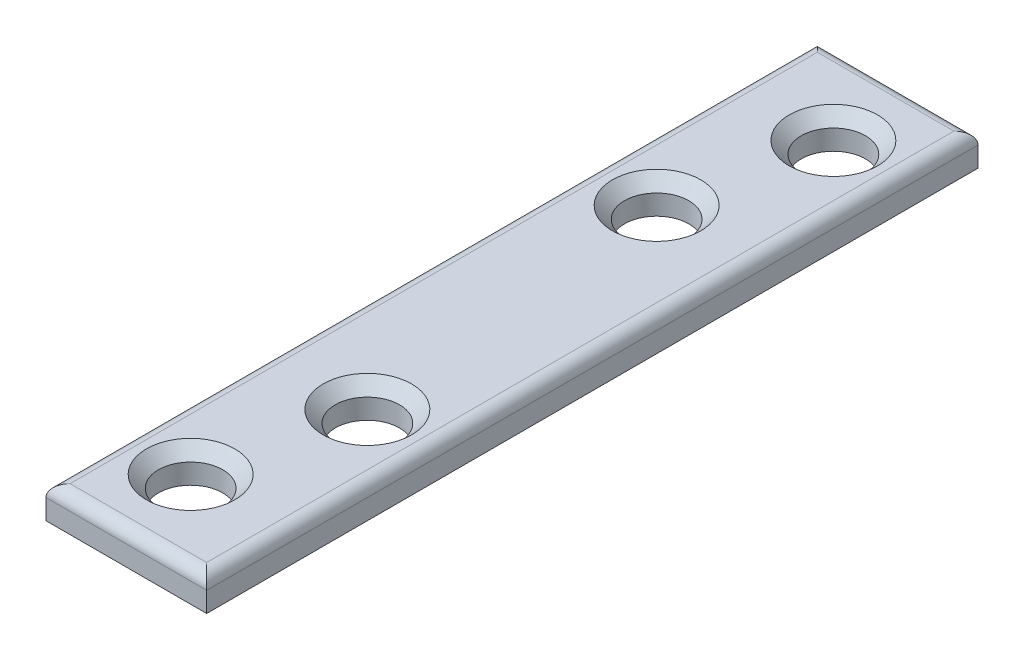
ISO-10303-21;
HEADER;
FILE_DESCRIPTION(('STEP AP214'),'2;1');
FILE_NAME('part.step','',(''),(''),'','','');
FILE_SCHEMA(('AUTOMOTIVE_DESIGN { 1 0 10303 214 1 1 1 1 }'));
ENDSEC;
DATA;
#1=APPLICATION_CONTEXT('core data for automotive mechanical design processes');
#2=APPLICATION_PROTOCOL_DEFINITION('international standard','automotive_design',2000,#1);
#3=PRODUCT_CONTEXT('',#1,'mechanical');
#4=PRODUCT('Part','Part','',(#3));
#5=PRODUCT_RELATED_PRODUCT_CATEGORY('part','',(#4));
#6=PRODUCT_DEFINITION_FORMATION('','',#4);
#7=PRODUCT_DEFINITION_CONTEXT('part definition',#1,'design');
#8=PRODUCT_DEFINITION('design','',#6,#7);
#9=PRODUCT_DEFINITION_SHAPE('','',#8);
#10=(LENGTH_UNIT() NAMED_UNIT(*) SI_UNIT(.MILLI.,.METRE.));
#11=(NAMED_UNIT(*) PLANE_ANGLE_UNIT() SI_UNIT($,.RADIAN.));
#12=(NAMED_UNIT(*) SI_UNIT($,.STERADIAN.) SOLID_ANGLE_UNIT());
#13=UNCERTAINTY_MEASURE_WITH_UNIT(LENGTH_MEASURE(1.E-05),#10,'distance_accuracy_value','');
#14=(GEOMETRIC_REPRESENTATION_CONTEXT(3) GLOBAL_UNCERTAINTY_ASSIGNED_CONTEXT((#13)) GLOBAL_UNIT_ASSIGNED_CONTEXT((#10,
#11,#12)) REPRESENTATION_CONTEXT('',''));
#15=CARTESIAN_POINT('',(0.,0.,0.));
#16=DIRECTION('',(0.,0.,1.));
#17=DIRECTION('',(1.,0.,0.));
#18=AXIS2_PLACEMENT_3D('',#15,#16,#17);
#19=CARTESIAN_POINT('',(0.,3.175,0.));
#20=DIRECTION('',(1.,0.,0.));
#21=DIRECTION('',(0.,0.,-1.));
#22=AXIS2_PLACEMENT_3D('',#19,#20,#21);
#23=PLANE('',#22);
#24=DIRECTION('',(0.,-1.,0.));
#25=VECTOR('',#24,1.);
#26=CARTESIAN_POINT('',(0.,3.175,0.));
#27=LINE('',#26,#25);
#28=CARTESIAN_POINT('',(0.,1.984375,0.));
#29=VERTEX_POINT('',#28);
#30=CARTESIAN_POINT('',(0.,0.,0.));
#31=VERTEX_POINT('',#30);
#32=EDGE_CURVE('E87',#29,#31,#27,.T.);
#33=ORIENTED_EDGE('',*,*,#32,.F.);
#34=DIRECTION('',(0.,0.,1.));
#35=VECTOR('',#34,1.);
#36=CARTESIAN_POINT('',(0.,1.984375,0.));
#37=LINE('',#36,#35);
#38=CARTESIAN_POINT('',(0.,1.984375,-76.2));
#39=VERTEX_POINT('',#38);
#40=EDGE_CURVE('E11',#29,#39,#37,.F.);
#41=ORIENTED_EDGE('',*,*,#40,.T.);
#42=DIRECTION('',(0.,-1.,0.));
#43=VECTOR('',#42,1.);
#44=CARTESIAN_POINT('',(0.,3.175,-76.2));
#45=LINE('',#44,#43);
#46=CARTESIAN_POINT('',(0.,0.,-76.2));
#47=VERTEX_POINT('',#46);
#48=EDGE_CURVE('E107',#39,#47,#45,.T.);
#49=ORIENTED_EDGE('',*,*,#48,.T.);
#50=DIRECTION('',(0.,0.,1.));
#51=VECTOR('',#50,1.);
#52=CARTESIAN_POINT('',(0.,0.,0.));
#53=LINE('',#52,#51);
#54=EDGE_CURVE('E102',#47,#31,#53,.T.);
#55=ORIENTED_EDGE('',*,*,#54,.T.);
#56=EDGE_LOOP('',(#33,#41,#49,#55));
#57=FACE_BOUND('',#56,.T.);
#58=ADVANCED_FACE('F35',(#57),#23,.F.);
#59=CARTESIAN_POINT('',(0.,3.175,0.));
#60=DIRECTION('',(0.,0.,-1.));
#61=DIRECTION('',(-1.,0.,0.));
#62=AXIS2_PLACEMENT_3D('',#59,#60,#61);
#63=PLANE('',#62);
#64=DIRECTION('',(0.,-1.,0.));
#65=VECTOR('',#64,1.);
#66=CARTESIAN_POINT('',(15.875,3.175,0.));
#67=LINE('',#66,#65);
#68=CARTESIAN_POINT('',(15.875,1.984375,0.));
#69=VERTEX_POINT('',#68);
#70=CARTESIAN_POINT('',(15.875,0.,0.));
#71=VERTEX_POINT('',#70);
#72=EDGE_CURVE('E96',#69,#71,#67,.T.);
#73=ORIENTED_EDGE('',*,*,#72,.F.);
#74=DIRECTION('',(1.,0.,0.));
#75=VECTOR('',#74,1.);
#76=CARTESIAN_POINT('',(0.,1.984375,0.));
#77=LINE('',#76,#75);
#78=EDGE_CURVE('E44',#69,#29,#77,.F.);
#79=ORIENTED_EDGE('',*,*,#78,.T.);
#80=ORIENTED_EDGE('',*,*,#32,.T.);
#81=DIRECTION('',(1.,0.,0.));
#82=VECTOR('',#81,1.);
#83=CARTESIAN_POINT('',(0.,0.,0.));
#84=LINE('',#83,#82);
#85=EDGE_CURVE('E90',#31,#71,#84,.T.);
#86=ORIENTED_EDGE('',*,*,#85,.T.);
#87=EDGE_LOOP('',(#73,#79,#80,#86));
#88=FACE_BOUND('',#87,.T.);
#89=ADVANCED_FACE('F89',(#88),#63,.F.);
#90=CARTESIAN_POINT('',(15.875,3.175,0.));
#91=DIRECTION('',(-1.,0.,0.));
#92=DIRECTION('',(0.,0.,1.));
#93=AXIS2_PLACEMENT_3D('',#90,#91,#92);
#94=PLANE('',#93);
#95=DIRECTION('',(0.,-1.,0.));
#96=VECTOR('',#95,1.);
#97=CARTESIAN_POINT('',(15.875,3.175,-76.2));
#98=LINE('',#97,#96);
#99=CARTESIAN_POINT('',(15.875,1.984375,-76.2));
#100=VERTEX_POINT('',#99);
#101=CARTESIAN_POINT('',(15.875,0.,-76.2));
#102=VERTEX_POINT('',#101);
#103=EDGE_CURVE('E120',#100,#102,#98,.T.);
#104=ORIENTED_EDGE('',*,*,#103,.F.);
#105=DIRECTION('',(0.,0.,-1.));
#106=VECTOR('',#105,1.);
#107=CARTESIAN_POINT('',(15.875,1.984375,0.));
#108=LINE('',#107,#106);
#109=EDGE_CURVE('E59',#100,#69,#108,.F.);
#110=ORIENTED_EDGE('',*,*,#109,.T.);
#111=ORIENTED_EDGE('',*,*,#72,.T.);
#112=DIRECTION('',(0.,0.,-1.));
#113=VECTOR('',#112,1.);
#114=CARTESIAN_POINT('',(15.875,0.,0.));
#115=LINE('',#114,#113);
#116=EDGE_CURVE('E104',#71,#102,#115,.T.);
#117=ORIENTED_EDGE('',*,*,#116,.T.);
#118=EDGE_LOOP('',(#104,#110,#111,#117));
#119=FACE_BOUND('',#118,.T.);
#120=ADVANCED_FACE('F205',(#119),#94,.F.);
#121=CARTESIAN_POINT('',(0.,3.175,-76.2));
#122=DIRECTION('',(0.,0.,1.));
#123=DIRECTION('',(1.,0.,0.));
#124=AXIS2_PLACEMENT_3D('',#121,#122,#123);
#125=PLANE('',#124);
#126=ORIENTED_EDGE('',*,*,#48,.F.);
#127=DIRECTION('',(-1.,0.,0.));
#128=VECTOR('',#127,1.);
#129=CARTESIAN_POINT('',(0.,1.984375,-76.2));
#130=LINE('',#129,#128);
#131=EDGE_CURVE('E155',#39,#100,#130,.F.);
#132=ORIENTED_EDGE('',*,*,#131,.T.);
#133=ORIENTED_EDGE('',*,*,#103,.T.);
#134=DIRECTION('',(-1.,0.,0.));
#135=VECTOR('',#134,1.);
#136=CARTESIAN_POINT('',(0.,0.,-76.2));
#137=LINE('',#136,#135);
#138=EDGE_CURVE('E117',#102,#47,#137,.T.);
#139=ORIENTED_EDGE('',*,*,#138,.T.);
#140=EDGE_LOOP('',(#126,#132,#133,#139));
#141=FACE_BOUND('',#140,.T.);
#142=ADVANCED_FACE('F243',(#141),#125,.F.);
#143=CARTESIAN_POINT('',(0.,3.175,0.));
#144=DIRECTION('',(0.,-1.,0.));
#145=DIRECTION('',(0.,0.,-1.));
#146=AXIS2_PLACEMENT_3D('',#143,#144,#145);
#147=PLANE('',#146);
#148=DIRECTION('',(0.,0.,-1.));
#149=VECTOR('',#148,1.);
#150=CARTESIAN_POINT('',(14.684375,3.175,0.));
#151=LINE('',#150,#149);
#152=CARTESIAN_POINT('',(14.684375,3.175,-1.190625));
#153=VERTEX_POINT('',#152);
#154=CARTESIAN_POINT('',(14.684375,3.175,-75.009375));
#155=VERTEX_POINT('',#154);
#156=EDGE_CURVE('E150',#153,#155,#151,.T.);
#157=ORIENTED_EDGE('',*,*,#156,.T.);
#158=DIRECTION('',(-1.,0.,0.));
#159=VECTOR('',#158,1.);
#160=CARTESIAN_POINT('',(0.,3.175,-75.009375));
#161=LINE('',#160,#159);
#162=CARTESIAN_POINT('',(1.190625,3.175,-75.009375));
#163=VERTEX_POINT('',#162);
#164=EDGE_CURVE('E152',#155,#163,#161,.T.);
#165=ORIENTED_EDGE('',*,*,#164,.T.);
#166=DIRECTION('',(0.,0.,1.));
#167=VECTOR('',#166,1.);
#168=CARTESIAN_POINT('',(1.190625,3.175,0.));
#169=LINE('',#168,#167);
#170=CARTESIAN_POINT('',(1.190625,3.175,-1.190625));
#171=VERTEX_POINT('',#170);
#172=EDGE_CURVE('E146',#163,#171,#169,.T.);
#173=ORIENTED_EDGE('',*,*,#172,.T.);
#174=DIRECTION('',(1.,0.,0.));
#175=VECTOR('',#174,1.);
#176=CARTESIAN_POINT('',(0.,3.175,-1.190625));
#177=LINE('',#176,#175);
#178=EDGE_CURVE('E148',#171,#153,#177,.T.);
#179=ORIENTED_EDGE('',*,*,#178,.T.);
#180=EDGE_LOOP('',(#157,#165,#173,#179));
#181=FACE_BOUND('',#180,.T.);
#182=CARTESIAN_POINT('',(6.35,3.175,-7.9375));
#183=DIRECTION('',(0.,-1.,0.));
#184=DIRECTION('',(0.,0.,-1.));
#185=AXIS2_PLACEMENT_3D('',#182,#183,#184);
#186=CIRCLE('',#185,4.365625);
#187=CARTESIAN_POINT('',(6.35,3.175,-12.303125));
#188=VERTEX_POINT('',#187);
#189=EDGE_CURVE('E134',#188,#188,#186,.T.);
#190=ORIENTED_EDGE('',*,*,#189,.T.);
#191=EDGE_LOOP('',(#190));
#192=FACE_BOUND('',#191,.T.);
#193=CARTESIAN_POINT('',(9.525,3.175,-22.225));
#194=DIRECTION('',(0.,-1.,0.));
#195=DIRECTION('',(0.,0.,-1.));
#196=AXIS2_PLACEMENT_3D('',#193,#194,#195);
#197=CIRCLE('',#196,4.36562500000001);
#198=CARTESIAN_POINT('',(9.525,3.175,-26.590625));
#199=VERTEX_POINT('',#198);
#200=EDGE_CURVE('E131',#199,#199,#197,.T.);
#201=ORIENTED_EDGE('',*,*,#200,.T.);
#202=EDGE_LOOP('',(#201));
#203=FACE_BOUND('',#202,.T.);
#204=CARTESIAN_POINT('',(9.525,3.175,-68.2625));
#205=DIRECTION('',(0.,-1.,0.));
#206=DIRECTION('',(0.,0.,-1.));
#207=AXIS2_PLACEMENT_3D('',#204,#205,#206);
#208=CIRCLE('',#207,4.36562499999998);
#209=CARTESIAN_POINT('',(9.525,3.175,-63.896875));
#210=VERTEX_POINT('',#209);
#211=EDGE_CURVE('E128',#210,#210,#208,.T.);
#212=ORIENTED_EDGE('',*,*,#211,.T.);
#213=EDGE_LOOP('',(#212));
#214=FACE_BOUND('',#213,.T.);
#215=CARTESIAN_POINT('',(6.35,3.175,-53.975));
#216=DIRECTION('',(0.,-1.,0.));
#217=DIRECTION('',(0.,0.,-1.));
#218=AXIS2_PLACEMENT_3D('',#215,#216,#217);
#219=CIRCLE('',#218,4.365625);
#220=CARTESIAN_POINT('',(6.35,3.175,-58.340625));
#221=VERTEX_POINT('',#220);
#222=EDGE_CURVE('E125',#221,#221,#219,.T.);
#223=ORIENTED_EDGE('',*,*,#222,.T.);
#224=EDGE_LOOP('',(#223));
#225=FACE_BOUND('',#224,.T.);
#226=ADVANCED_FACE('F247',(#181,#192,#203,#214,#225),#147,.F.);
#227=CARTESIAN_POINT('',(0.,0.,0.));
#228=DIRECTION('',(0.,-1.,0.));
#229=DIRECTION('',(0.,0.,-1.));
#230=AXIS2_PLACEMENT_3D('',#227,#228,#229);
#231=PLANE('',#230);
#232=CARTESIAN_POINT('',(6.35,0.,-7.9375));
#233=DIRECTION('',(0.,1.,0.));
#234=DIRECTION('',(0.,0.,1.));
#235=AXIS2_PLACEMENT_3D('',#232,#233,#234);
#236=CIRCLE('',#235,3.175);
#237=CARTESIAN_POINT('',(6.35,0.,-4.7625));
#238=VERTEX_POINT('',#237);
#239=EDGE_CURVE('E169',#238,#238,#236,.T.);
#240=ORIENTED_EDGE('',*,*,#239,.T.);
#241=EDGE_LOOP('',(#240));
#242=FACE_BOUND('',#241,.T.);
#243=CARTESIAN_POINT('',(9.525,0.,-22.225));
#244=DIRECTION('',(0.,1.,0.));
#245=DIRECTION('',(0.,0.,1.));
#246=AXIS2_PLACEMENT_3D('',#243,#244,#245);
#247=CIRCLE('',#246,3.175);
#248=CARTESIAN_POINT('',(9.525,0.,-19.05));
#249=VERTEX_POINT('',#248);
#250=EDGE_CURVE('E174',#249,#249,#247,.T.);
#251=ORIENTED_EDGE('',*,*,#250,.T.);
#252=EDGE_LOOP('',(#251));
#253=FACE_BOUND('',#252,.T.);
#254=CARTESIAN_POINT('',(9.525,0.,-68.2625));
#255=DIRECTION('',(0.,1.,0.));
#256=DIRECTION('',(0.,0.,1.));
#257=AXIS2_PLACEMENT_3D('',#254,#255,#256);
#258=CIRCLE('',#257,3.175);
#259=CARTESIAN_POINT('',(9.525,0.,-65.0875));
#260=VERTEX_POINT('',#259);
#261=EDGE_CURVE('E112',#260,#260,#258,.T.);
#262=ORIENTED_EDGE('',*,*,#261,.T.);
#263=EDGE_LOOP('',(#262));
#264=FACE_BOUND('',#263,.T.);
#265=CARTESIAN_POINT('',(6.35,0.,-53.975));
#266=DIRECTION('',(0.,1.,0.));
#267=DIRECTION('',(0.,0.,1.));
#268=AXIS2_PLACEMENT_3D('',#265,#266,#267);
#269=CIRCLE('',#268,3.175);
#270=CARTESIAN_POINT('',(6.35,0.,-50.8));
#271=VERTEX_POINT('',#270);
#272=EDGE_CURVE('E109',#271,#271,#269,.T.);
#273=ORIENTED_EDGE('',*,*,#272,.T.);
#274=EDGE_LOOP('',(#273));
#275=FACE_BOUND('',#274,.T.);
#276=ORIENTED_EDGE('',*,*,#54,.F.);
#277=ORIENTED_EDGE('',*,*,#138,.F.);
#278=ORIENTED_EDGE('',*,*,#116,.F.);
#279=ORIENTED_EDGE('',*,*,#85,.F.);
#280=EDGE_LOOP('',(#276,#277,#278,#279));
#281=FACE_BOUND('',#280,.T.);
#282=ADVANCED_FACE('F100',(#242,#253,#264,#275,#281),#231,.T.);
#283=CARTESIAN_POINT('',(6.35,0.,-53.975));
#284=DIRECTION('',(0.,1.,0.));
#285=DIRECTION('',(0.,0.,1.));
#286=AXIS2_PLACEMENT_3D('',#283,#284,#285);
#287=CYLINDRICAL_SURFACE('',#286,3.175);
#288=CARTESIAN_POINT('',(6.35,1.98437500000001,-53.975));
#289=DIRECTION('',(0.,-1.,0.));
#290=DIRECTION('',(0.,0.,-1.));
#291=AXIS2_PLACEMENT_3D('',#288,#289,#290);
#292=CIRCLE('',#291,3.175);
#293=CARTESIAN_POINT('',(6.35,1.98437500000001,-57.15));
#294=VERTEX_POINT('',#293);
#295=EDGE_CURVE('E143',#294,#294,#292,.F.);
#296=ORIENTED_EDGE('',*,*,#295,.T.);
#297=EDGE_LOOP('',(#296));
#298=FACE_BOUND('',#297,.T.);
#299=ORIENTED_EDGE('',*,*,#272,.F.);
#300=EDGE_LOOP('',(#299));
#301=FACE_BOUND('',#300,.T.);
#302=ADVANCED_FACE('F188',(#298,#301),#287,.F.);
#303=CARTESIAN_POINT('',(9.525,0.,-68.2625));
#304=DIRECTION('',(0.,1.,0.));
#305=DIRECTION('',(0.,0.,1.));
#306=AXIS2_PLACEMENT_3D('',#303,#304,#305);
#307=CYLINDRICAL_SURFACE('',#306,3.175);
#308=CARTESIAN_POINT('',(9.525,1.98437500000002,-68.2625));
#309=DIRECTION('',(0.,-1.,0.));
#310=DIRECTION('',(0.,0.,-1.));
#311=AXIS2_PLACEMENT_3D('',#308,#309,#310);
#312=CIRCLE('',#311,3.175);
#313=CARTESIAN_POINT('',(9.525,1.98437500000002,-65.0875));
#314=VERTEX_POINT('',#313);
#315=EDGE_CURVE('E140',#314,#314,#312,.F.);
#316=ORIENTED_EDGE('',*,*,#315,.T.);
#317=EDGE_LOOP('',(#316));
#318=FACE_BOUND('',#317,.T.);
#319=ORIENTED_EDGE('',*,*,#261,.F.);
#320=EDGE_LOOP('',(#319));
#321=FACE_BOUND('',#320,.T.);
#322=ADVANCED_FACE('F185',(#318,#321),#307,.F.);
#323=CARTESIAN_POINT('',(9.525,0.,-22.225));
#324=DIRECTION('',(0.,1.,0.));
#325=DIRECTION('',(0.,0.,1.));
#326=AXIS2_PLACEMENT_3D('',#323,#324,#325);
#327=CYLINDRICAL_SURFACE('',#326,3.175);
#328=CARTESIAN_POINT('',(9.525,1.98437499999999,-22.225));
#329=DIRECTION('',(0.,-1.,0.));
#330=DIRECTION('',(0.,0.,-1.));
#331=AXIS2_PLACEMENT_3D('',#328,#329,#330);
#332=CIRCLE('',#331,3.175);
#333=CARTESIAN_POINT('',(9.525,1.98437499999999,-25.4));
#334=VERTEX_POINT('',#333);
#335=EDGE_CURVE('E137',#334,#334,#332,.F.);
#336=ORIENTED_EDGE('',*,*,#335,.T.);
#337=EDGE_LOOP('',(#336));
#338=FACE_BOUND('',#337,.T.);
#339=ORIENTED_EDGE('',*,*,#250,.F.);
#340=EDGE_LOOP('',(#339));
#341=FACE_BOUND('',#340,.T.);
#342=ADVANCED_FACE('F187',(#338,#341),#327,.F.);
#343=CARTESIAN_POINT('',(6.35,0.,-7.9375));
#344=DIRECTION('',(0.,1.,0.));
#345=DIRECTION('',(0.,0.,1.));
#346=AXIS2_PLACEMENT_3D('',#343,#344,#345);
#347=CYLINDRICAL_SURFACE('',#346,3.175);
#348=CARTESIAN_POINT('',(6.35,1.98437500000001,-7.9375));
#349=DIRECTION('',(0.,-1.,0.));
#350=DIRECTION('',(0.,0.,-1.));
#351=AXIS2_PLACEMENT_3D('',#348,#349,#350);
#352=CIRCLE('',#351,3.175);
#353=CARTESIAN_POINT('',(6.35,1.98437500000001,-11.1125));
#354=VERTEX_POINT('',#353);
#355=EDGE_CURVE('E95',#354,#354,#352,.F.);
#356=ORIENTED_EDGE('',*,*,#355,.T.);
#357=EDGE_LOOP('',(#356));
#358=FACE_BOUND('',#357,.T.);
#359=ORIENTED_EDGE('',*,*,#239,.F.);
#360=EDGE_LOOP('',(#359));
#361=FACE_BOUND('',#360,.T.);
#362=ADVANCED_FACE('F195',(#358,#361),#347,.F.);
#363=CARTESIAN_POINT('',(6.35,1.98437500000001,-7.9375));
#364=DIRECTION('',(0.,1.,0.));
#365=DIRECTION('',(0.,0.,1.));
#366=AXIS2_PLACEMENT_3D('',#363,#364,#365);
#367=CONICAL_SURFACE('',#366,3.175,0.785398163397452);
#368=ORIENTED_EDGE('',*,*,#189,.F.);
#369=EDGE_LOOP('',(#368));
#370=FACE_BOUND('',#369,.T.);
#371=ORIENTED_EDGE('',*,*,#355,.F.);
#372=EDGE_LOOP('',(#371));
#373=FACE_BOUND('',#372,.T.);
#374=ADVANCED_FACE('F209',(#370,#373),#367,.F.);
#375=CARTESIAN_POINT('',(9.525,1.98437499999999,-22.225));
#376=DIRECTION('',(0.,1.,0.));
#377=DIRECTION('',(0.,0.,1.));
#378=AXIS2_PLACEMENT_3D('',#375,#376,#377);
#379=CONICAL_SURFACE('',#378,3.175,0.785398163397449);
#380=ORIENTED_EDGE('',*,*,#200,.F.);
#381=EDGE_LOOP('',(#380));
#382=FACE_BOUND('',#381,.T.);
#383=ORIENTED_EDGE('',*,*,#335,.F.);
#384=EDGE_LOOP('',(#383));
#385=FACE_BOUND('',#384,.T.);
#386=ADVANCED_FACE('F212',(#382,#385),#379,.F.);
#387=CARTESIAN_POINT('',(9.525,1.98437500000002,-68.2625));
#388=DIRECTION('',(0.,1.,0.));
#389=DIRECTION('',(0.,0.,1.));
#390=AXIS2_PLACEMENT_3D('',#387,#388,#389);
#391=CONICAL_SURFACE('',#390,3.175,0.785398163397452);
#392=CARTESIAN_POINT('',(9.525,3.175,-63.896875));
#393=CARTESIAN_POINT('',(9.525,3.16259765625,-63.90927734375));
#394=CARTESIAN_POINT('',(9.525,3.1501953125,-63.9216796875));
#395=CARTESIAN_POINT('',(9.525,3.125390625,-63.946484375));
#396=CARTESIAN_POINT('',(9.525,3.11298828125,-63.95888671875));
#397=CARTESIAN_POINT('',(9.525,3.08818359375,-63.98369140625));
#398=CARTESIAN_POINT('',(9.525,3.07578125,-63.99609375));
#399=CARTESIAN_POINT('',(9.525,3.0509765625,-64.0208984375));
#400=CARTESIAN_POINT('',(9.525,3.03857421875,-64.03330078125));
#401=CARTESIAN_POINT('',(9.525,3.01376953125,-64.05810546875));
#402=CARTESIAN_POINT('',(9.525,3.0013671875,-64.0705078125));
#403=CARTESIAN_POINT('',(9.525,2.9765625,-64.0953125));
#404=CARTESIAN_POINT('',(9.525,2.96416015625,-64.10771484375));
#405=CARTESIAN_POINT('',(9.525,2.93935546875001,-64.13251953125));
#406=CARTESIAN_POINT('',(9.525,2.92695312500001,-64.144921875));
#407=CARTESIAN_POINT('',(9.525,2.90214843750001,-64.1697265625));
#408=CARTESIAN_POINT('',(9.525,2.88974609375001,-64.18212890625));
#409=CARTESIAN_POINT('',(9.525,2.86494140625001,-64.20693359375));
#410=CARTESIAN_POINT('',(9.525,2.85253906250001,-64.2193359375));
#411=CARTESIAN_POINT('',(9.525,2.82773437500001,-64.244140625));
#412=CARTESIAN_POINT('',(9.525,2.81533203125001,-64.25654296875));
#413=CARTESIAN_POINT('',(9.525,2.79052734375001,-64.28134765625));
#414=CARTESIAN_POINT('',(9.525,2.77812500000001,-64.29375));
#415=CARTESIAN_POINT('',(9.525,2.75332031250001,-64.3185546875));
#416=CARTESIAN_POINT('',(9.525,2.74091796875001,-64.33095703125));
#417=CARTESIAN_POINT('',(9.525,2.71611328125001,-64.35576171875));
#418=CARTESIAN_POINT('',(9.525,2.70371093750001,-64.3681640625));
#419=CARTESIAN_POINT('',(9.525,2.67890625000001,-64.39296875));
#420=CARTESIAN_POINT('',(9.525,2.66650390625001,-64.40537109375));
#421=CARTESIAN_POINT('',(9.525,2.64169921875001,-64.43017578125));
#422=CARTESIAN_POINT('',(9.525,2.62929687500001,-64.442578125));
#423=CARTESIAN_POINT('',(9.525,2.60449218750001,-64.4673828125));
#424=CARTESIAN_POINT('',(9.525,2.59208984375001,-64.47978515625));
#425=CARTESIAN_POINT('',(9.525,2.56728515625001,-64.50458984375));
#426=CARTESIAN_POINT('',(9.525,2.55488281250001,-64.5169921875));
#427=CARTESIAN_POINT('',(9.525,2.53007812500001,-64.541796875));
#428=CARTESIAN_POINT('',(9.525,2.51767578125001,-64.55419921875));
#429=CARTESIAN_POINT('',(9.525,2.49287109375001,-64.57900390625));
#430=CARTESIAN_POINT('',(9.525,2.48046875000001,-64.59140625));
#431=CARTESIAN_POINT('',(9.525,2.45566406250002,-64.6162109375));
#432=CARTESIAN_POINT('',(9.525,2.44326171875002,-64.62861328125));
#433=CARTESIAN_POINT('',(9.525,2.41845703125002,-64.65341796875));
#434=CARTESIAN_POINT('',(9.525,2.40605468750002,-64.6658203125));
#435=CARTESIAN_POINT('',(9.525,2.38125000000002,-64.690625));
#436=CARTESIAN_POINT('',(9.525,2.36884765625002,-64.70302734375));
#437=CARTESIAN_POINT('',(9.525,2.34404296875002,-64.72783203125));
#438=CARTESIAN_POINT('',(9.525,2.33164062500002,-64.740234375));
#439=CARTESIAN_POINT('',(9.525,2.30683593750002,-64.7650390625));
#440=CARTESIAN_POINT('',(9.525,2.29443359375002,-64.77744140625));
#441=CARTESIAN_POINT('',(9.525,2.26962890625002,-64.80224609375));
#442=CARTESIAN_POINT('',(9.525,2.25722656250002,-64.8146484375));
#443=CARTESIAN_POINT('',(9.525,2.23242187500002,-64.839453125));
#444=CARTESIAN_POINT('',(9.525,2.22001953125002,-64.85185546875));
#445=CARTESIAN_POINT('',(9.525,2.19521484375002,-64.87666015625));
#446=CARTESIAN_POINT('',(9.525,2.18281250000002,-64.8890625));
#447=CARTESIAN_POINT('',(9.525,2.15800781250002,-64.9138671875));
#448=CARTESIAN_POINT('',(9.525,2.14560546875002,-64.92626953125));
#449=CARTESIAN_POINT('',(9.525,2.12080078125002,-64.95107421875));
#450=CARTESIAN_POINT('',(9.525,2.10839843750002,-64.9634765625));
#451=CARTESIAN_POINT('',(9.525,2.08359375000002,-64.98828125));
#452=CARTESIAN_POINT('',(9.525,2.07119140625002,-65.00068359375));
#453=CARTESIAN_POINT('',(9.525,2.04638671875002,-65.02548828125));
#454=CARTESIAN_POINT('',(9.525,2.03398437500002,-65.037890625));
#455=CARTESIAN_POINT('',(9.525,2.00917968750002,-65.0626953125));
#456=CARTESIAN_POINT('',(9.525,1.99677734375002,-65.07509765625));
#457=CARTESIAN_POINT('',(9.525,1.98437500000002,-65.0875));
#458=B_SPLINE_CURVE_WITH_KNOTS('',3,(#392,#393,#394,#395,#396,#397,#398,#399,#400,#401,#402,
#403,#404,#405,#406,#407,#408,#409,#410,#411,#412,#413,#414,#415,#416,#417,#418,#419,#420,#421,
#422,#423,#424,#425,#426,#427,#428,#429,#430,#431,#432,#433,#434,#435,#436,#437,#438,#439,#440,
#441,#442,#443,#444,#445,#446,#447,#448,#449,#450,#451,#452,#453,#454,#455,#456,#457),
.UNSPECIFIED.,.F.,.F.,(4,2,2,2,2,2,2,2,2,2,2,2,2,2,2,2,2,2,2,2,2,2,2,2,2,2,2,2,2,2,2,2,4),(0.,
0.052618688209389,0.105237376418778,0.157856064628167,0.210474752837556,0.263093441046945,
0.315712129256334,0.368330817465723,0.420949505675112,0.473568193884501,0.52618688209389,
0.57880557030328,0.631424258512668,0.684042946722048,0.736661634931437,0.789280323140826,
0.841899011350214,0.894517699559604,0.947136387768993,0.999755075978382,1.05237376418777,
1.10499245239716,1.15761114060655,1.21022982881594,1.26284851702533,1.31546720523472,
1.3680858934441,1.42070458165349,1.47332326986288,1.52594195807227,1.57856064628166,
1.63117933449105,1.68379802270044),.UNSPECIFIED.);
#459=EDGE_CURVE('BSEAM216',#210,#314,#458,.T.);
#460=ORIENTED_EDGE('',*,*,#211,.F.);
#461=ORIENTED_EDGE('',*,*,#315,.F.);
#462=ORIENTED_EDGE('',*,*,#459,.T.);
#463=ORIENTED_EDGE('',*,*,#459,.F.);
#464=EDGE_LOOP('',(#460,#462,#461,#463));
#465=FACE_BOUND('',#464,.T.);
#466=ADVANCED_FACE('F216',(#465),#391,.F.);
#467=CARTESIAN_POINT('',(6.35,1.98437500000001,-53.975));
#468=DIRECTION('',(0.,1.,0.));
#469=DIRECTION('',(0.,0.,1.));
#470=AXIS2_PLACEMENT_3D('',#467,#468,#469);
#471=CONICAL_SURFACE('',#470,3.175,0.785398163397452);
#472=ORIENTED_EDGE('',*,*,#222,.F.);
#473=EDGE_LOOP('',(#472));
#474=FACE_BOUND('',#473,.T.);
#475=ORIENTED_EDGE('',*,*,#295,.F.);
#476=EDGE_LOOP('',(#475));
#477=FACE_BOUND('',#476,.T.);
#478=ADVANCED_FACE('F220',(#474,#477),#471,.F.);
#479=CARTESIAN_POINT('',(0.,1.984375,-1.190625));
#480=DIRECTION('',(1.,0.,0.));
#481=DIRECTION('',(0.,0.,-1.));
#482=AXIS2_PLACEMENT_3D('',#479,#480,#481);
#483=CYLINDRICAL_SURFACE('',#482,1.190625);
#484=CARTESIAN_POINT('',(1.190625,1.984375,-1.190625));
#485=DIRECTION('',(0.707106781186547,0.,0.707106781186547));
#486=DIRECTION('',(-0.707106781186547,0.,0.707106781186547));
#487=AXIS2_PLACEMENT_3D('',#484,#485,#486);
#488=ELLIPSE('',#487,1.68379802270047,1.190625);
#489=EDGE_CURVE('E163',#29,#171,#488,.F.);
#490=ORIENTED_EDGE('',*,*,#489,.F.);
#491=ORIENTED_EDGE('',*,*,#78,.F.);
#492=CARTESIAN_POINT('',(14.684375,1.984375,-1.190625));
#493=DIRECTION('',(0.707106781186547,0.,-0.707106781186547));
#494=DIRECTION('',(0.707106781186547,0.,0.707106781186547));
#495=AXIS2_PLACEMENT_3D('',#492,#493,#494);
#496=ELLIPSE('',#495,1.68379802270047,1.190625);
#497=EDGE_CURVE('E39',#153,#69,#496,.T.);
#498=ORIENTED_EDGE('',*,*,#497,.F.);
#499=ORIENTED_EDGE('',*,*,#178,.F.);
#500=EDGE_LOOP('',(#490,#491,#498,#499));
#501=FACE_BOUND('',#500,.T.);
#502=ADVANCED_FACE('F37',(#501),#483,.T.);
#503=CARTESIAN_POINT('',(14.684375,1.984375,0.));
#504=DIRECTION('',(0.,0.,-1.));
#505=DIRECTION('',(-1.,0.,0.));
#506=AXIS2_PLACEMENT_3D('',#503,#504,#505);
#507=CYLINDRICAL_SURFACE('',#506,1.190625);
#508=ORIENTED_EDGE('',*,*,#497,.T.);
#509=ORIENTED_EDGE('',*,*,#109,.F.);
#510=CARTESIAN_POINT('',(14.684375,1.984375,-75.009375));
#511=DIRECTION('',(-0.707106781186547,0.,-0.707106781186547));
#512=DIRECTION('',(0.707106781186547,0.,-0.707106781186547));
#513=AXIS2_PLACEMENT_3D('',#510,#511,#512);
#514=ELLIPSE('',#513,1.68379802270047,1.190625);
#515=EDGE_CURVE('E162',#155,#100,#514,.T.);
#516=ORIENTED_EDGE('',*,*,#515,.F.);
#517=ORIENTED_EDGE('',*,*,#156,.F.);
#518=EDGE_LOOP('',(#508,#509,#516,#517));
#519=FACE_BOUND('',#518,.T.);
#520=ADVANCED_FACE('F231',(#519),#507,.T.);
#521=CARTESIAN_POINT('',(1.190625,1.984375,0.));
#522=DIRECTION('',(0.,0.,1.));
#523=DIRECTION('',(1.,0.,0.));
#524=AXIS2_PLACEMENT_3D('',#521,#522,#523);
#525=CYLINDRICAL_SURFACE('',#524,1.190625);
#526=ORIENTED_EDGE('',*,*,#489,.T.);
#527=ORIENTED_EDGE('',*,*,#172,.F.);
#528=CARTESIAN_POINT('',(1.190625,1.984375,-75.009375));
#529=DIRECTION('',(-0.707106781186547,0.,0.707106781186547));
#530=DIRECTION('',(0.707106781186547,0.,0.707106781186547));
#531=AXIS2_PLACEMENT_3D('',#528,#529,#530);
#532=ELLIPSE('',#531,1.68379802270047,1.190625);
#533=EDGE_CURVE('E160',#39,#163,#532,.F.);
#534=ORIENTED_EDGE('',*,*,#533,.F.);
#535=ORIENTED_EDGE('',*,*,#40,.F.);
#536=EDGE_LOOP('',(#526,#527,#534,#535));
#537=FACE_BOUND('',#536,.T.);
#538=ADVANCED_FACE('F228',(#537),#525,.T.);
#539=CARTESIAN_POINT('',(0.,1.984375,-75.009375));
#540=DIRECTION('',(-1.,0.,0.));
#541=DIRECTION('',(0.,0.,1.));
#542=AXIS2_PLACEMENT_3D('',#539,#540,#541);
#543=CYLINDRICAL_SURFACE('',#542,1.190625);
#544=ORIENTED_EDGE('',*,*,#515,.T.);
#545=ORIENTED_EDGE('',*,*,#131,.F.);
#546=ORIENTED_EDGE('',*,*,#533,.T.);
#547=ORIENTED_EDGE('',*,*,#164,.F.);
#548=EDGE_LOOP('',(#544,#545,#546,#547));
#549=FACE_BOUND('',#548,.T.);
#550=ADVANCED_FACE('F225',(#549),#543,.T.);
#551=CLOSED_SHELL('',(#58,#89,#120,#142,#226,#282,#302,#322,#342,#362,#374,#386,#466,#478,#502,
#520,#538,#550));
#552=MANIFOLD_SOLID_BREP('B2',#551);
#553=ADVANCED_BREP_SHAPE_REPRESENTATION('',(#18,#552),#14);
#554=SHAPE_DEFINITION_REPRESENTATION(#9,#553);
ENDSEC;
END-ISO-10303-21;
